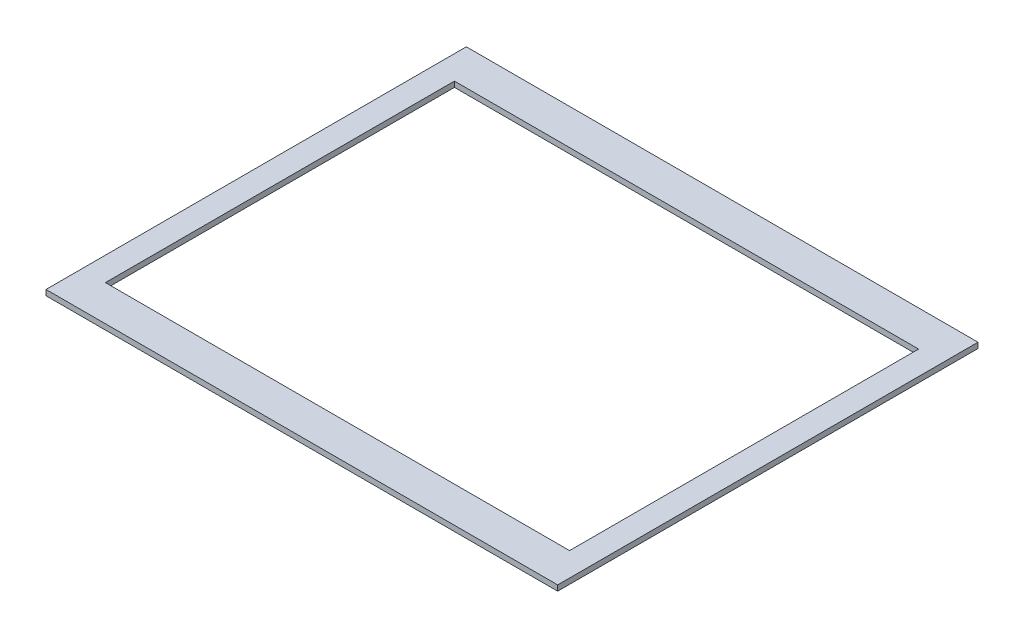
ISO-10303-21;
HEADER;
FILE_DESCRIPTION(('STEP AP214'),'2;1');
FILE_NAME('part.step','',(''),(''),'','','');
FILE_SCHEMA(('AUTOMOTIVE_DESIGN { 1 0 10303 214 1 1 1 1 }'));
ENDSEC;
DATA;
#1=APPLICATION_CONTEXT('core data for automotive mechanical design processes');
#2=APPLICATION_PROTOCOL_DEFINITION('international standard','automotive_design',2000,#1);
#3=PRODUCT_CONTEXT('',#1,'mechanical');
#4=PRODUCT('Part','Part','',(#3));
#5=PRODUCT_RELATED_PRODUCT_CATEGORY('part','',(#4));
#6=PRODUCT_DEFINITION_FORMATION('','',#4);
#7=PRODUCT_DEFINITION_CONTEXT('part definition',#1,'design');
#8=PRODUCT_DEFINITION('design','',#6,#7);
#9=PRODUCT_DEFINITION_SHAPE('','',#8);
#10=(LENGTH_UNIT() NAMED_UNIT(*) SI_UNIT(.MILLI.,.METRE.));
#11=(NAMED_UNIT(*) PLANE_ANGLE_UNIT() SI_UNIT($,.RADIAN.));
#12=(NAMED_UNIT(*) SI_UNIT($,.STERADIAN.) SOLID_ANGLE_UNIT());
#13=UNCERTAINTY_MEASURE_WITH_UNIT(LENGTH_MEASURE(1.E-05),#10,'distance_accuracy_value','');
#14=(GEOMETRIC_REPRESENTATION_CONTEXT(3) GLOBAL_UNCERTAINTY_ASSIGNED_CONTEXT((#13)) GLOBAL_UNIT_ASSIGNED_CONTEXT((#10,
#11,#12)) REPRESENTATION_CONTEXT('',''));
#15=CARTESIAN_POINT('',(0.,0.,0.));
#16=DIRECTION('',(0.,0.,1.));
#17=DIRECTION('',(1.,0.,0.));
#18=AXIS2_PLACEMENT_3D('',#15,#16,#17);
#19=CARTESIAN_POINT('',(0.,3.,0.));
#20=DIRECTION('',(0.,-1.,0.));
#21=DIRECTION('',(0.,0.,-1.));
#22=AXIS2_PLACEMENT_3D('',#19,#20,#21);
#23=PLANE('',#22);
#24=DIRECTION('',(0.,0.,1.));
#25=VECTOR('',#24,1.);
#26=CARTESIAN_POINT('',(0.,3.,0.));
#27=LINE('',#26,#25);
#28=CARTESIAN_POINT('',(0.,3.,-230.));
#29=VERTEX_POINT('',#28);
#30=CARTESIAN_POINT('',(0.,3.,0.));
#31=VERTEX_POINT('',#30);
#32=EDGE_CURVE('E153',#29,#31,#27,.T.);
#33=ORIENTED_EDGE('',*,*,#32,.T.);
#34=DIRECTION('',(1.,0.,0.));
#35=VECTOR('',#34,1.);
#36=CARTESIAN_POINT('',(0.,3.,0.));
#37=LINE('',#36,#35);
#38=CARTESIAN_POINT('',(280.,3.,0.));
#39=VERTEX_POINT('',#38);
#40=EDGE_CURVE('E157',#31,#39,#37,.T.);
#41=ORIENTED_EDGE('',*,*,#40,.T.);
#42=DIRECTION('',(0.,0.,-1.));
#43=VECTOR('',#42,1.);
#44=CARTESIAN_POINT('',(280.,3.,0.));
#45=LINE('',#44,#43);
#46=CARTESIAN_POINT('',(280.,3.,-230.));
#47=VERTEX_POINT('',#46);
#48=EDGE_CURVE('E161',#39,#47,#45,.T.);
#49=ORIENTED_EDGE('',*,*,#48,.T.);
#50=DIRECTION('',(-1.,0.,0.));
#51=VECTOR('',#50,1.);
#52=CARTESIAN_POINT('',(0.,3.,-230.));
#53=LINE('',#52,#51);
#54=EDGE_CURVE('E164',#47,#29,#53,.T.);
#55=ORIENTED_EDGE('',*,*,#54,.T.);
#56=EDGE_LOOP('',(#33,#41,#49,#55));
#57=FACE_BOUND('',#56,.T.);
#58=DIRECTION('',(0.,0.,-1.));
#59=VECTOR('',#58,1.);
#60=CARTESIAN_POINT('',(267.,3.,-19.5));
#61=LINE('',#60,#59);
#62=CARTESIAN_POINT('',(267.,3.,-19.5));
#63=VERTEX_POINT('',#62);
#64=CARTESIAN_POINT('',(267.,3.,-210.5));
#65=VERTEX_POINT('',#64);
#66=EDGE_CURVE('E105',#63,#65,#61,.T.);
#67=ORIENTED_EDGE('',*,*,#66,.F.);
#68=DIRECTION('',(1.,0.,0.));
#69=VECTOR('',#68,1.);
#70=CARTESIAN_POINT('',(13.,3.,-19.5));
#71=LINE('',#70,#69);
#72=CARTESIAN_POINT('',(13.,3.,-19.5));
#73=VERTEX_POINT('',#72);
#74=EDGE_CURVE('E131',#73,#63,#71,.T.);
#75=ORIENTED_EDGE('',*,*,#74,.F.);
#76=DIRECTION('',(0.,0.,1.));
#77=VECTOR('',#76,1.);
#78=CARTESIAN_POINT('',(13.,3.,-19.5));
#79=LINE('',#78,#77);
#80=CARTESIAN_POINT('',(13.,3.,-210.5));
#81=VERTEX_POINT('',#80);
#82=EDGE_CURVE('E127',#81,#73,#79,.T.);
#83=ORIENTED_EDGE('',*,*,#82,.F.);
#84=DIRECTION('',(-1.,0.,0.));
#85=VECTOR('',#84,1.);
#86=CARTESIAN_POINT('',(13.,3.,-210.5));
#87=LINE('',#86,#85);
#88=EDGE_CURVE('E114',#65,#81,#87,.T.);
#89=ORIENTED_EDGE('',*,*,#88,.F.);
#90=EDGE_LOOP('',(#67,#75,#83,#89));
#91=FACE_BOUND('',#90,.T.);
#92=ADVANCED_FACE('F39',(#57,#91),#23,.F.);
#93=CARTESIAN_POINT('',(0.,0.,0.));
#94=DIRECTION('',(0.,-1.,0.));
#95=DIRECTION('',(0.,0.,-1.));
#96=AXIS2_PLACEMENT_3D('',#93,#94,#95);
#97=PLANE('',#96);
#98=DIRECTION('',(0.,0.,1.));
#99=VECTOR('',#98,1.);
#100=CARTESIAN_POINT('',(0.,0.,0.));
#101=LINE('',#100,#99);
#102=CARTESIAN_POINT('',(0.,0.,-230.));
#103=VERTEX_POINT('',#102);
#104=CARTESIAN_POINT('',(0.,0.,0.));
#105=VERTEX_POINT('',#104);
#106=EDGE_CURVE('E123',#103,#105,#101,.T.);
#107=ORIENTED_EDGE('',*,*,#106,.F.);
#108=DIRECTION('',(-1.,0.,0.));
#109=VECTOR('',#108,1.);
#110=CARTESIAN_POINT('',(0.,0.,-230.));
#111=LINE('',#110,#109);
#112=CARTESIAN_POINT('',(280.,0.,-230.));
#113=VERTEX_POINT('',#112);
#114=EDGE_CURVE('E158',#113,#103,#111,.T.);
#115=ORIENTED_EDGE('',*,*,#114,.F.);
#116=DIRECTION('',(0.,0.,-1.));
#117=VECTOR('',#116,1.);
#118=CARTESIAN_POINT('',(280.,0.,0.));
#119=LINE('',#118,#117);
#120=CARTESIAN_POINT('',(280.,0.,0.));
#121=VERTEX_POINT('',#120);
#122=EDGE_CURVE('E174',#121,#113,#119,.T.);
#123=ORIENTED_EDGE('',*,*,#122,.F.);
#124=DIRECTION('',(1.,0.,0.));
#125=VECTOR('',#124,1.);
#126=CARTESIAN_POINT('',(0.,0.,0.));
#127=LINE('',#126,#125);
#128=EDGE_CURVE('E171',#105,#121,#127,.T.);
#129=ORIENTED_EDGE('',*,*,#128,.F.);
#130=EDGE_LOOP('',(#107,#115,#123,#129));
#131=FACE_BOUND('',#130,.T.);
#132=DIRECTION('',(1.,0.,0.));
#133=VECTOR('',#132,1.);
#134=CARTESIAN_POINT('',(13.,0.,-19.5));
#135=LINE('',#134,#133);
#136=CARTESIAN_POINT('',(13.,0.,-19.5));
#137=VERTEX_POINT('',#136);
#138=CARTESIAN_POINT('',(267.,0.,-19.5));
#139=VERTEX_POINT('',#138);
#140=EDGE_CURVE('E115',#137,#139,#135,.T.);
#141=ORIENTED_EDGE('',*,*,#140,.T.);
#142=DIRECTION('',(0.,0.,-1.));
#143=VECTOR('',#142,1.);
#144=CARTESIAN_POINT('',(267.,0.,-19.5));
#145=LINE('',#144,#143);
#146=CARTESIAN_POINT('',(267.,0.,-210.5));
#147=VERTEX_POINT('',#146);
#148=EDGE_CURVE('E63',#139,#147,#145,.T.);
#149=ORIENTED_EDGE('',*,*,#148,.T.);
#150=DIRECTION('',(-1.,0.,0.));
#151=VECTOR('',#150,1.);
#152=CARTESIAN_POINT('',(13.,0.,-210.5));
#153=LINE('',#152,#151);
#154=CARTESIAN_POINT('',(13.,0.,-210.5));
#155=VERTEX_POINT('',#154);
#156=EDGE_CURVE('E121',#147,#155,#153,.T.);
#157=ORIENTED_EDGE('',*,*,#156,.T.);
#158=DIRECTION('',(0.,0.,1.));
#159=VECTOR('',#158,1.);
#160=CARTESIAN_POINT('',(13.,0.,-19.5));
#161=LINE('',#160,#159);
#162=EDGE_CURVE('E140',#155,#137,#161,.T.);
#163=ORIENTED_EDGE('',*,*,#162,.T.);
#164=EDGE_LOOP('',(#141,#149,#157,#163));
#165=FACE_BOUND('',#164,.T.);
#166=ADVANCED_FACE('F197',(#131,#165),#97,.T.);
#167=CARTESIAN_POINT('',(0.,3.,0.));
#168=DIRECTION('',(1.,0.,0.));
#169=DIRECTION('',(0.,0.,-1.));
#170=AXIS2_PLACEMENT_3D('',#167,#168,#169);
#171=PLANE('',#170);
#172=ORIENTED_EDGE('',*,*,#106,.T.);
#173=DIRECTION('',(0.,-1.,0.));
#174=VECTOR('',#173,1.);
#175=CARTESIAN_POINT('',(0.,3.,0.));
#176=LINE('',#175,#174);
#177=EDGE_CURVE('E11',#31,#105,#176,.T.);
#178=ORIENTED_EDGE('',*,*,#177,.F.);
#179=ORIENTED_EDGE('',*,*,#32,.F.);
#180=DIRECTION('',(0.,-1.,0.));
#181=VECTOR('',#180,1.);
#182=CARTESIAN_POINT('',(0.,3.,-230.));
#183=LINE('',#182,#181);
#184=EDGE_CURVE('E167',#29,#103,#183,.T.);
#185=ORIENTED_EDGE('',*,*,#184,.T.);
#186=EDGE_LOOP('',(#172,#178,#179,#185));
#187=FACE_BOUND('',#186,.T.);
#188=ADVANCED_FACE('F41',(#187),#171,.F.);
#189=CARTESIAN_POINT('',(0.,3.,0.));
#190=DIRECTION('',(0.,0.,-1.));
#191=DIRECTION('',(-1.,0.,0.));
#192=AXIS2_PLACEMENT_3D('',#189,#190,#191);
#193=PLANE('',#192);
#194=ORIENTED_EDGE('',*,*,#128,.T.);
#195=DIRECTION('',(0.,-1.,0.));
#196=VECTOR('',#195,1.);
#197=CARTESIAN_POINT('',(280.,3.,0.));
#198=LINE('',#197,#196);
#199=EDGE_CURVE('E48',#39,#121,#198,.T.);
#200=ORIENTED_EDGE('',*,*,#199,.F.);
#201=ORIENTED_EDGE('',*,*,#40,.F.);
#202=ORIENTED_EDGE('',*,*,#177,.T.);
#203=EDGE_LOOP('',(#194,#200,#201,#202));
#204=FACE_BOUND('',#203,.T.);
#205=ADVANCED_FACE('F207',(#204),#193,.F.);
#206=CARTESIAN_POINT('',(280.,3.,0.));
#207=DIRECTION('',(-1.,0.,0.));
#208=DIRECTION('',(0.,0.,1.));
#209=AXIS2_PLACEMENT_3D('',#206,#207,#208);
#210=PLANE('',#209);
#211=ORIENTED_EDGE('',*,*,#122,.T.);
#212=DIRECTION('',(0.,-1.,0.));
#213=VECTOR('',#212,1.);
#214=CARTESIAN_POINT('',(280.,3.,-230.));
#215=LINE('',#214,#213);
#216=EDGE_CURVE('E182',#47,#113,#215,.T.);
#217=ORIENTED_EDGE('',*,*,#216,.F.);
#218=ORIENTED_EDGE('',*,*,#48,.F.);
#219=ORIENTED_EDGE('',*,*,#199,.T.);
#220=EDGE_LOOP('',(#211,#217,#218,#219));
#221=FACE_BOUND('',#220,.T.);
#222=ADVANCED_FACE('F191',(#221),#210,.F.);
#223=CARTESIAN_POINT('',(0.,3.,-230.));
#224=DIRECTION('',(0.,0.,1.));
#225=DIRECTION('',(1.,0.,0.));
#226=AXIS2_PLACEMENT_3D('',#223,#224,#225);
#227=PLANE('',#226);
#228=ORIENTED_EDGE('',*,*,#114,.T.);
#229=ORIENTED_EDGE('',*,*,#184,.F.);
#230=ORIENTED_EDGE('',*,*,#54,.F.);
#231=ORIENTED_EDGE('',*,*,#216,.T.);
#232=EDGE_LOOP('',(#228,#229,#230,#231));
#233=FACE_BOUND('',#232,.T.);
#234=ADVANCED_FACE('F201',(#233),#227,.F.);
#235=CARTESIAN_POINT('',(267.,3.,-19.5));
#236=DIRECTION('',(-1.,0.,0.));
#237=DIRECTION('',(0.,0.,1.));
#238=AXIS2_PLACEMENT_3D('',#235,#236,#237);
#239=PLANE('',#238);
#240=ORIENTED_EDGE('',*,*,#148,.F.);
#241=DIRECTION('',(0.,-1.,0.));
#242=VECTOR('',#241,1.);
#243=CARTESIAN_POINT('',(267.,3.,-19.5));
#244=LINE('',#243,#242);
#245=EDGE_CURVE('E109',#63,#139,#244,.T.);
#246=ORIENTED_EDGE('',*,*,#245,.F.);
#247=ORIENTED_EDGE('',*,*,#66,.T.);
#248=DIRECTION('',(0.,-1.,0.));
#249=VECTOR('',#248,1.);
#250=CARTESIAN_POINT('',(267.,3.,-210.5));
#251=LINE('',#250,#249);
#252=EDGE_CURVE('E108',#65,#147,#251,.T.);
#253=ORIENTED_EDGE('',*,*,#252,.T.);
#254=EDGE_LOOP('',(#240,#246,#247,#253));
#255=FACE_BOUND('',#254,.T.);
#256=ADVANCED_FACE('F107',(#255),#239,.T.);
#257=CARTESIAN_POINT('',(13.,3.,-210.5));
#258=DIRECTION('',(0.,0.,1.));
#259=DIRECTION('',(1.,0.,0.));
#260=AXIS2_PLACEMENT_3D('',#257,#258,#259);
#261=PLANE('',#260);
#262=ORIENTED_EDGE('',*,*,#156,.F.);
#263=ORIENTED_EDGE('',*,*,#252,.F.);
#264=ORIENTED_EDGE('',*,*,#88,.T.);
#265=DIRECTION('',(0.,-1.,0.));
#266=VECTOR('',#265,1.);
#267=CARTESIAN_POINT('',(13.,3.,-210.5));
#268=LINE('',#267,#266);
#269=EDGE_CURVE('E124',#81,#155,#268,.T.);
#270=ORIENTED_EDGE('',*,*,#269,.T.);
#271=EDGE_LOOP('',(#262,#263,#264,#270));
#272=FACE_BOUND('',#271,.T.);
#273=ADVANCED_FACE('F118',(#272),#261,.T.);
#274=CARTESIAN_POINT('',(13.,3.,-19.5));
#275=DIRECTION('',(1.,0.,0.));
#276=DIRECTION('',(0.,0.,-1.));
#277=AXIS2_PLACEMENT_3D('',#274,#275,#276);
#278=PLANE('',#277);
#279=ORIENTED_EDGE('',*,*,#162,.F.);
#280=ORIENTED_EDGE('',*,*,#269,.F.);
#281=ORIENTED_EDGE('',*,*,#82,.T.);
#282=DIRECTION('',(0.,-1.,0.));
#283=VECTOR('',#282,1.);
#284=CARTESIAN_POINT('',(13.,3.,-19.5));
#285=LINE('',#284,#283);
#286=EDGE_CURVE('E55',#73,#137,#285,.T.);
#287=ORIENTED_EDGE('',*,*,#286,.T.);
#288=EDGE_LOOP('',(#279,#280,#281,#287));
#289=FACE_BOUND('',#288,.T.);
#290=ADVANCED_FACE('F230',(#289),#278,.T.);
#291=CARTESIAN_POINT('',(13.,3.,-19.5));
#292=DIRECTION('',(0.,0.,-1.));
#293=DIRECTION('',(-1.,0.,0.));
#294=AXIS2_PLACEMENT_3D('',#291,#292,#293);
#295=PLANE('',#294);
#296=ORIENTED_EDGE('',*,*,#140,.F.);
#297=ORIENTED_EDGE('',*,*,#286,.F.);
#298=ORIENTED_EDGE('',*,*,#74,.T.);
#299=ORIENTED_EDGE('',*,*,#245,.T.);
#300=EDGE_LOOP('',(#296,#297,#298,#299));
#301=FACE_BOUND('',#300,.T.);
#302=ADVANCED_FACE('F234',(#301),#295,.T.);
#303=CLOSED_SHELL('',(#92,#166,#188,#205,#222,#234,#256,#273,#290,#302));
#304=MANIFOLD_SOLID_BREP('B2',#303);
#305=ADVANCED_BREP_SHAPE_REPRESENTATION('',(#18,#304),#14);
#306=SHAPE_DEFINITION_REPRESENTATION(#9,#305);
ENDSEC;
END-ISO-10303-21;
